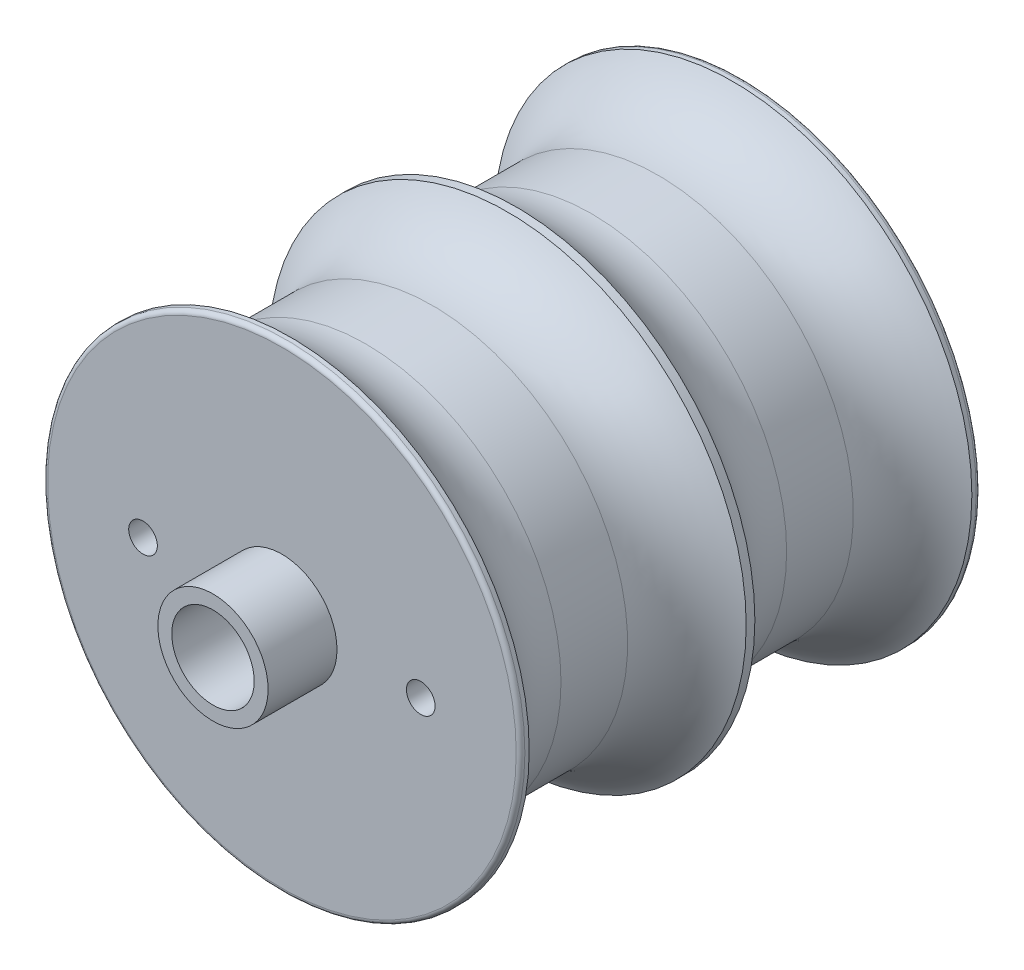
ISO-10303-21;
HEADER;
FILE_DESCRIPTION(('STEP AP214'),'2;1');
FILE_NAME('part.step','',(''),(''),'','','');
FILE_SCHEMA(('AUTOMOTIVE_DESIGN { 1 0 10303 214 1 1 1 1 }'));
ENDSEC;
DATA;
#1=APPLICATION_CONTEXT('core data for automotive mechanical design processes');
#2=APPLICATION_PROTOCOL_DEFINITION('international standard','automotive_design',2000,#1);
#3=PRODUCT_CONTEXT('',#1,'mechanical');
#4=PRODUCT('Part','Part','',(#3));
#5=PRODUCT_RELATED_PRODUCT_CATEGORY('part','',(#4));
#6=PRODUCT_DEFINITION_FORMATION('','',#4);
#7=PRODUCT_DEFINITION_CONTEXT('part definition',#1,'design');
#8=PRODUCT_DEFINITION('design','',#6,#7);
#9=PRODUCT_DEFINITION_SHAPE('','',#8);
#10=(LENGTH_UNIT() NAMED_UNIT(*) SI_UNIT(.MILLI.,.METRE.));
#11=(NAMED_UNIT(*) PLANE_ANGLE_UNIT() SI_UNIT($,.RADIAN.));
#12=(NAMED_UNIT(*) SI_UNIT($,.STERADIAN.) SOLID_ANGLE_UNIT());
#13=UNCERTAINTY_MEASURE_WITH_UNIT(LENGTH_MEASURE(1.E-05),#10,'distance_accuracy_value','');
#14=(GEOMETRIC_REPRESENTATION_CONTEXT(3) GLOBAL_UNCERTAINTY_ASSIGNED_CONTEXT((#13)) GLOBAL_UNIT_ASSIGNED_CONTEXT((#10,
#11,#12)) REPRESENTATION_CONTEXT('',''));
#15=CARTESIAN_POINT('',(0.,0.,0.));
#16=DIRECTION('',(0.,0.,1.));
#17=DIRECTION('',(1.,0.,0.));
#18=AXIS2_PLACEMENT_3D('',#15,#16,#17);
#19=CARTESIAN_POINT('',(0.,0.,60.938));
#20=DIRECTION('',(0.,0.,1.));
#21=DIRECTION('',(1.,0.,0.));
#22=AXIS2_PLACEMENT_3D('',#19,#20,#21);
#23=PLANE('',#22);
#24=CARTESIAN_POINT('',(0.,0.,60.938));
#25=DIRECTION('',(0.,0.,1.));
#26=DIRECTION('',(1.,0.,0.));
#27=AXIS2_PLACEMENT_3D('',#24,#25,#26);
#28=CIRCLE('',#27,6.35);
#29=CARTESIAN_POINT('',(6.35,0.,60.938));
#30=VERTEX_POINT('',#29);
#31=EDGE_CURVE('E12',#30,#30,#28,.T.);
#32=ORIENTED_EDGE('',*,*,#31,.T.);
#33=EDGE_LOOP('',(#32));
#34=FACE_BOUND('',#33,.T.);
#35=CARTESIAN_POINT('',(0.,0.,60.938));
#36=DIRECTION('',(0.,0.,1.));
#37=DIRECTION('',(1.,0.,0.));
#38=AXIS2_PLACEMENT_3D('',#35,#36,#37);
#39=CIRCLE('',#38,4.75);
#40=CARTESIAN_POINT('',(4.75,0.,60.938));
#41=VERTEX_POINT('',#40);
#42=EDGE_CURVE('E134',#41,#41,#39,.T.);
#43=ORIENTED_EDGE('',*,*,#42,.F.);
#44=EDGE_LOOP('',(#43));
#45=FACE_BOUND('',#44,.T.);
#46=ADVANCED_FACE('F123',(#34,#45),#23,.T.);
#47=CARTESIAN_POINT('',(0.,0.,53.));
#48=DIRECTION('',(0.,0.,1.));
#49=DIRECTION('',(1.,0.,0.));
#50=AXIS2_PLACEMENT_3D('',#47,#48,#49);
#51=PLANE('',#50);
#52=CARTESIAN_POINT('',(0.,0.,53.));
#53=DIRECTION('',(0.,0.,1.));
#54=DIRECTION('',(1.,0.,0.));
#55=AXIS2_PLACEMENT_3D('',#52,#53,#54);
#56=CIRCLE('',#55,6.35);
#57=CARTESIAN_POINT('',(6.35,0.,53.));
#58=VERTEX_POINT('',#57);
#59=EDGE_CURVE('E127',#58,#58,#56,.T.);
#60=ORIENTED_EDGE('',*,*,#59,.F.);
#61=EDGE_LOOP('',(#60));
#62=FACE_BOUND('',#61,.T.);
#63=CARTESIAN_POINT('',(0.,0.,53.));
#64=DIRECTION('',(0.,0.,1.));
#65=DIRECTION('',(1.,0.,0.));
#66=AXIS2_PLACEMENT_3D('',#63,#64,#65);
#67=CIRCLE('',#66,4.75);
#68=CARTESIAN_POINT('',(4.75,0.,53.));
#69=VERTEX_POINT('',#68);
#70=EDGE_CURVE('E136',#69,#69,#67,.T.);
#71=ORIENTED_EDGE('',*,*,#70,.T.);
#72=EDGE_LOOP('',(#71));
#73=FACE_BOUND('',#72,.T.);
#74=ADVANCED_FACE('F146',(#62,#73),#51,.F.);
#75=CARTESIAN_POINT('',(0.,0.,60.938));
#76=DIRECTION('',(0.,0.,-1.));
#77=DIRECTION('',(-1.,0.,0.));
#78=AXIS2_PLACEMENT_3D('',#75,#76,#77);
#79=CYLINDRICAL_SURFACE('',#78,6.35);
#80=ORIENTED_EDGE('',*,*,#31,.F.);
#81=EDGE_LOOP('',(#80));
#82=FACE_BOUND('',#81,.T.);
#83=ORIENTED_EDGE('',*,*,#59,.T.);
#84=EDGE_LOOP('',(#83));
#85=FACE_BOUND('',#84,.T.);
#86=ADVANCED_FACE('F125',(#82,#85),#79,.T.);
#87=CARTESIAN_POINT('',(0.,0.,60.938));
#88=DIRECTION('',(0.,0.,-1.));
#89=DIRECTION('',(-1.,0.,0.));
#90=AXIS2_PLACEMENT_3D('',#87,#88,#89);
#91=CYLINDRICAL_SURFACE('',#90,4.75);
#92=ORIENTED_EDGE('',*,*,#42,.T.);
#93=EDGE_LOOP('',(#92));
#94=FACE_BOUND('',#93,.T.);
#95=ORIENTED_EDGE('',*,*,#70,.F.);
#96=EDGE_LOOP('',(#95));
#97=FACE_BOUND('',#96,.T.);
#98=ADVANCED_FACE('F142',(#94,#97),#91,.F.);
#99=CLOSED_SHELL('',(#46,#74,#86,#98));
#100=MANIFOLD_SOLID_BREP('B2',#99);
#101=CARTESIAN_POINT('',(0.,0.,1.));
#102=DIRECTION('',(0.,0.,-1.));
#103=DIRECTION('',(-1.,0.,0.));
#104=AXIS2_PLACEMENT_3D('',#101,#102,#103);
#105=CYLINDRICAL_SURFACE('',#104,27.5);
#106=CARTESIAN_POINT('',(0.,0.,0.5));
#107=DIRECTION('',(0.,0.,1.));
#108=DIRECTION('',(1.,0.,0.));
#109=AXIS2_PLACEMENT_3D('',#106,#107,#108);
#110=CIRCLE('',#109,27.5);
#111=CARTESIAN_POINT('',(27.5,0.,0.5));
#112=VERTEX_POINT('',#111);
#113=EDGE_CURVE('E200',#112,#112,#110,.T.);
#114=ORIENTED_EDGE('',*,*,#113,.T.);
#115=EDGE_LOOP('',(#114));
#116=FACE_BOUND('',#115,.T.);
#117=CARTESIAN_POINT('',(0.,0.,1.));
#118=DIRECTION('',(0.,0.,1.));
#119=DIRECTION('',(1.,0.,0.));
#120=AXIS2_PLACEMENT_3D('',#117,#118,#119);
#121=CIRCLE('',#120,27.5);
#122=CARTESIAN_POINT('',(27.5,0.,1.));
#123=VERTEX_POINT('',#122);
#124=EDGE_CURVE('E225',#123,#123,#121,.T.);
#125=ORIENTED_EDGE('',*,*,#124,.F.);
#126=EDGE_LOOP('',(#125));
#127=FACE_BOUND('',#126,.T.);
#128=ADVANCED_FACE('F193',(#116,#127),#105,.T.);
#129=CARTESIAN_POINT('',(-16.,0.,1.));
#130=DIRECTION('',(0.,0.,-1.));
#131=DIRECTION('',(-1.,0.,0.));
#132=AXIS2_PLACEMENT_3D('',#129,#130,#131);
#133=CYLINDRICAL_SURFACE('',#132,1.65);
#134=CARTESIAN_POINT('',(-16.,0.,0.));
#135=DIRECTION('',(0.,0.,1.));
#136=DIRECTION('',(1.,0.,0.));
#137=AXIS2_PLACEMENT_3D('',#134,#135,#136);
#138=CIRCLE('',#137,1.65);
#139=CARTESIAN_POINT('',(-14.35,0.,0.));
#140=VERTEX_POINT('',#139);
#141=EDGE_CURVE('E229',#140,#140,#138,.T.);
#142=ORIENTED_EDGE('',*,*,#141,.F.);
#143=EDGE_LOOP('',(#142));
#144=FACE_BOUND('',#143,.T.);
#145=CARTESIAN_POINT('',(-16.,0.,53.));
#146=DIRECTION('',(0.,0.,1.));
#147=DIRECTION('',(1.,0.,0.));
#148=AXIS2_PLACEMENT_3D('',#145,#146,#147);
#149=CIRCLE('',#148,1.65);
#150=CARTESIAN_POINT('',(-14.35,0.,53.));
#151=VERTEX_POINT('',#150);
#152=EDGE_CURVE('E249',#151,#151,#149,.T.);
#153=ORIENTED_EDGE('',*,*,#152,.T.);
#154=EDGE_LOOP('',(#153));
#155=FACE_BOUND('',#154,.T.);
#156=ADVANCED_FACE('F276',(#144,#155),#133,.F.);
#157=CARTESIAN_POINT('',(16.,0.,1.));
#158=DIRECTION('',(0.,0.,-1.));
#159=DIRECTION('',(-1.,0.,0.));
#160=AXIS2_PLACEMENT_3D('',#157,#158,#159);
#161=CYLINDRICAL_SURFACE('',#160,1.65);
#162=CARTESIAN_POINT('',(16.,0.,0.));
#163=DIRECTION('',(0.,0.,1.));
#164=DIRECTION('',(1.,0.,0.));
#165=AXIS2_PLACEMENT_3D('',#162,#163,#164);
#166=CIRCLE('',#165,1.65);
#167=CARTESIAN_POINT('',(17.65,0.,0.));
#168=VERTEX_POINT('',#167);
#169=EDGE_CURVE('E232',#168,#168,#166,.T.);
#170=ORIENTED_EDGE('',*,*,#169,.F.);
#171=EDGE_LOOP('',(#170));
#172=FACE_BOUND('',#171,.T.);
#173=CARTESIAN_POINT('',(16.,0.,53.));
#174=DIRECTION('',(0.,0.,1.));
#175=DIRECTION('',(1.,0.,0.));
#176=AXIS2_PLACEMENT_3D('',#173,#174,#175);
#177=CIRCLE('',#176,1.65);
#178=CARTESIAN_POINT('',(17.65,0.,53.));
#179=VERTEX_POINT('',#178);
#180=EDGE_CURVE('E252',#179,#179,#177,.T.);
#181=ORIENTED_EDGE('',*,*,#180,.T.);
#182=EDGE_LOOP('',(#181));
#183=FACE_BOUND('',#182,.T.);
#184=ADVANCED_FACE('F256',(#172,#183),#161,.F.);
#185=CARTESIAN_POINT('',(0.,0.,1.));
#186=DIRECTION('',(0.,0.,-1.));
#187=DIRECTION('',(-1.,0.,0.));
#188=AXIS2_PLACEMENT_3D('',#185,#186,#187);
#189=CYLINDRICAL_SURFACE('',#188,4.75);
#190=CARTESIAN_POINT('',(0.,0.,0.));
#191=DIRECTION('',(0.,0.,1.));
#192=DIRECTION('',(1.,0.,0.));
#193=AXIS2_PLACEMENT_3D('',#190,#191,#192);
#194=CIRCLE('',#193,4.75);
#195=CARTESIAN_POINT('',(4.75,0.,0.));
#196=VERTEX_POINT('',#195);
#197=EDGE_CURVE('E226',#196,#196,#194,.T.);
#198=ORIENTED_EDGE('',*,*,#197,.F.);
#199=EDGE_LOOP('',(#198));
#200=FACE_BOUND('',#199,.T.);
#201=CARTESIAN_POINT('',(0.,0.,53.));
#202=DIRECTION('',(0.,0.,1.));
#203=DIRECTION('',(1.,0.,0.));
#204=AXIS2_PLACEMENT_3D('',#201,#202,#203);
#205=CIRCLE('',#204,4.75);
#206=CARTESIAN_POINT('',(4.75,0.,53.));
#207=VERTEX_POINT('',#206);
#208=EDGE_CURVE('E246',#207,#207,#205,.T.);
#209=ORIENTED_EDGE('',*,*,#208,.T.);
#210=EDGE_LOOP('',(#209));
#211=FACE_BOUND('',#210,.T.);
#212=ADVANCED_FACE('F285',(#200,#211),#189,.F.);
#213=CARTESIAN_POINT('',(0.,0.,0.));
#214=DIRECTION('',(0.,0.,1.));
#215=DIRECTION('',(1.,0.,0.));
#216=AXIS2_PLACEMENT_3D('',#213,#214,#215);
#217=PLANE('',#216);
#218=CARTESIAN_POINT('',(0.,0.,0.));
#219=DIRECTION('',(0.,0.,1.));
#220=DIRECTION('',(1.,0.,0.));
#221=AXIS2_PLACEMENT_3D('',#218,#219,#220);
#222=CIRCLE('',#221,27.);
#223=CARTESIAN_POINT('',(27.,0.,0.));
#224=VERTEX_POINT('',#223);
#225=EDGE_CURVE('E122',#224,#224,#222,.F.);
#226=ORIENTED_EDGE('',*,*,#225,.T.);
#227=EDGE_LOOP('',(#226));
#228=FACE_BOUND('',#227,.T.);
#229=ORIENTED_EDGE('',*,*,#169,.T.);
#230=EDGE_LOOP('',(#229));
#231=FACE_BOUND('',#230,.T.);
#232=ORIENTED_EDGE('',*,*,#141,.T.);
#233=EDGE_LOOP('',(#232));
#234=FACE_BOUND('',#233,.T.);
#235=ORIENTED_EDGE('',*,*,#197,.T.);
#236=EDGE_LOOP('',(#235));
#237=FACE_BOUND('',#236,.T.);
#238=ADVANCED_FACE('F346',(#228,#231,#234,#237),#217,.F.);
#239=CARTESIAN_POINT('',(0.,0.,26.));
#240=DIRECTION('',(0.,0.,-1.));
#241=DIRECTION('',(-1.,0.,0.));
#242=AXIS2_PLACEMENT_3D('',#239,#240,#241);
#243=CYLINDRICAL_SURFACE('',#242,22.5);
#244=CARTESIAN_POINT('',(0.,0.,17.3397459621556));
#245=DIRECTION('',(0.,0.,1.));
#246=DIRECTION('',(1.,0.,0.));
#247=AXIS2_PLACEMENT_3D('',#244,#245,#246);
#248=CIRCLE('',#247,22.5);
#249=CARTESIAN_POINT('',(22.5,0.,17.3397459621556));
#250=VERTEX_POINT('',#249);
#251=EDGE_CURVE('E213',#250,#250,#248,.F.);
#252=ORIENTED_EDGE('',*,*,#251,.T.);
#253=EDGE_LOOP('',(#252));
#254=FACE_BOUND('',#253,.T.);
#255=CARTESIAN_POINT('',(0.,0.,9.66025403784438));
#256=DIRECTION('',(0.,0.,-1.));
#257=DIRECTION('',(-1.,0.,0.));
#258=AXIS2_PLACEMENT_3D('',#255,#256,#257);
#259=CIRCLE('',#258,22.5);
#260=CARTESIAN_POINT('',(-22.5,0.,9.66025403784438));
#261=VERTEX_POINT('',#260);
#262=EDGE_CURVE('E216',#261,#261,#259,.F.);
#263=ORIENTED_EDGE('',*,*,#262,.T.);
#264=EDGE_LOOP('',(#263));
#265=FACE_BOUND('',#264,.T.);
#266=ADVANCED_FACE('F350',(#254,#265),#243,.T.);
#267=CARTESIAN_POINT('',(0.,0.,27.));
#268=DIRECTION('',(0.,0.,-1.));
#269=DIRECTION('',(-1.,0.,0.));
#270=AXIS2_PLACEMENT_3D('',#267,#268,#269);
#271=CYLINDRICAL_SURFACE('',#270,27.5);
#272=CARTESIAN_POINT('',(0.,0.,27.));
#273=DIRECTION('',(0.,0.,1.));
#274=DIRECTION('',(1.,0.,0.));
#275=AXIS2_PLACEMENT_3D('',#272,#273,#274);
#276=CIRCLE('',#275,27.5);
#277=CARTESIAN_POINT('',(27.5,0.,27.));
#278=VERTEX_POINT('',#277);
#279=EDGE_CURVE('E235',#278,#278,#276,.T.);
#280=ORIENTED_EDGE('',*,*,#279,.F.);
#281=EDGE_LOOP('',(#280));
#282=FACE_BOUND('',#281,.T.);
#283=CARTESIAN_POINT('',(0.,0.,26.));
#284=DIRECTION('',(0.,0.,1.));
#285=DIRECTION('',(1.,0.,0.));
#286=AXIS2_PLACEMENT_3D('',#283,#284,#285);
#287=CIRCLE('',#286,27.5);
#288=CARTESIAN_POINT('',(27.5,0.,26.));
#289=VERTEX_POINT('',#288);
#290=EDGE_CURVE('E238',#289,#289,#287,.T.);
#291=ORIENTED_EDGE('',*,*,#290,.T.);
#292=EDGE_LOOP('',(#291));
#293=FACE_BOUND('',#292,.T.);
#294=ADVANCED_FACE('F271',(#282,#293),#271,.T.);
#295=CARTESIAN_POINT('',(0.,0.,52.));
#296=DIRECTION('',(0.,0.,-1.));
#297=DIRECTION('',(-1.,0.,0.));
#298=AXIS2_PLACEMENT_3D('',#295,#296,#297);
#299=CYLINDRICAL_SURFACE('',#298,22.5);
#300=CARTESIAN_POINT('',(0.,0.,43.3397459621556));
#301=DIRECTION('',(0.,0.,1.));
#302=DIRECTION('',(1.,0.,0.));
#303=AXIS2_PLACEMENT_3D('',#300,#301,#302);
#304=CIRCLE('',#303,22.5);
#305=CARTESIAN_POINT('',(22.5,0.,43.3397459621556));
#306=VERTEX_POINT('',#305);
#307=EDGE_CURVE('E219',#306,#306,#304,.F.);
#308=ORIENTED_EDGE('',*,*,#307,.T.);
#309=EDGE_LOOP('',(#308));
#310=FACE_BOUND('',#309,.T.);
#311=CARTESIAN_POINT('',(0.,0.,35.6602540378444));
#312=DIRECTION('',(0.,0.,-1.));
#313=DIRECTION('',(-1.,0.,0.));
#314=AXIS2_PLACEMENT_3D('',#311,#312,#313);
#315=CIRCLE('',#314,22.5);
#316=CARTESIAN_POINT('',(-22.5,0.,35.6602540378444));
#317=VERTEX_POINT('',#316);
#318=EDGE_CURVE('E222',#317,#317,#315,.F.);
#319=ORIENTED_EDGE('',*,*,#318,.T.);
#320=EDGE_LOOP('',(#319));
#321=FACE_BOUND('',#320,.T.);
#322=ADVANCED_FACE('F261',(#310,#321),#299,.T.);
#323=CARTESIAN_POINT('',(0.,0.,53.));
#324=DIRECTION('',(0.,0.,1.));
#325=DIRECTION('',(1.,0.,0.));
#326=AXIS2_PLACEMENT_3D('',#323,#324,#325);
#327=PLANE('',#326);
#328=CARTESIAN_POINT('',(0.,0.,53.));
#329=DIRECTION('',(0.,0.,1.));
#330=DIRECTION('',(1.,0.,0.));
#331=AXIS2_PLACEMENT_3D('',#328,#329,#330);
#332=CIRCLE('',#331,27.);
#333=CARTESIAN_POINT('',(27.,0.,53.));
#334=VERTEX_POINT('',#333);
#335=EDGE_CURVE('E208',#334,#334,#332,.T.);
#336=ORIENTED_EDGE('',*,*,#335,.T.);
#337=EDGE_LOOP('',(#336));
#338=FACE_BOUND('',#337,.T.);
#339=ORIENTED_EDGE('',*,*,#152,.F.);
#340=EDGE_LOOP('',(#339));
#341=FACE_BOUND('',#340,.T.);
#342=ORIENTED_EDGE('',*,*,#208,.F.);
#343=EDGE_LOOP('',(#342));
#344=FACE_BOUND('',#343,.T.);
#345=ORIENTED_EDGE('',*,*,#180,.F.);
#346=EDGE_LOOP('',(#345));
#347=FACE_BOUND('',#346,.T.);
#348=ADVANCED_FACE('F258',(#338,#341,#344,#347),#327,.T.);
#349=CARTESIAN_POINT('',(0.,0.,53.));
#350=DIRECTION('',(0.,0.,-1.));
#351=DIRECTION('',(-1.,0.,0.));
#352=AXIS2_PLACEMENT_3D('',#349,#350,#351);
#353=CYLINDRICAL_SURFACE('',#352,27.5);
#354=CARTESIAN_POINT('',(0.,0.,52.5));
#355=DIRECTION('',(0.,0.,1.));
#356=DIRECTION('',(1.,0.,0.));
#357=AXIS2_PLACEMENT_3D('',#354,#355,#356);
#358=CIRCLE('',#357,27.5);
#359=CARTESIAN_POINT('',(27.5,0.,52.5));
#360=VERTEX_POINT('',#359);
#361=EDGE_CURVE('E204',#360,#360,#358,.F.);
#362=ORIENTED_EDGE('',*,*,#361,.T.);
#363=EDGE_LOOP('',(#362));
#364=FACE_BOUND('',#363,.T.);
#365=CARTESIAN_POINT('',(0.,0.,52.));
#366=DIRECTION('',(0.,0.,1.));
#367=DIRECTION('',(1.,0.,0.));
#368=AXIS2_PLACEMENT_3D('',#365,#366,#367);
#369=CIRCLE('',#368,27.5);
#370=CARTESIAN_POINT('',(27.5,0.,52.));
#371=VERTEX_POINT('',#370);
#372=EDGE_CURVE('E241',#371,#371,#369,.T.);
#373=ORIENTED_EDGE('',*,*,#372,.T.);
#374=EDGE_LOOP('',(#373));
#375=FACE_BOUND('',#374,.T.);
#376=ADVANCED_FACE('F260',(#364,#375),#353,.T.);
#377=CARTESIAN_POINT('',(0.,0.,43.3397459621556));
#378=DIRECTION('',(0.,0.,1.));
#379=DIRECTION('',(1.,0.,0.));
#380=AXIS2_PLACEMENT_3D('',#377,#378,#379);
#381=TOROIDAL_SURFACE('',#380,32.5,10.);
#382=ORIENTED_EDGE('',*,*,#307,.F.);
#383=EDGE_LOOP('',(#382));
#384=FACE_BOUND('',#383,.T.);
#385=ORIENTED_EDGE('',*,*,#372,.F.);
#386=EDGE_LOOP('',(#385));
#387=FACE_BOUND('',#386,.T.);
#388=ADVANCED_FACE('F268',(#384,#387),#381,.F.);
#389=CARTESIAN_POINT('',(0.,0.,35.6602540378444));
#390=DIRECTION('',(0.,0.,-1.));
#391=DIRECTION('',(-1.,0.,0.));
#392=AXIS2_PLACEMENT_3D('',#389,#390,#391);
#393=TOROIDAL_SURFACE('',#392,32.5,10.);
#394=ORIENTED_EDGE('',*,*,#279,.T.);
#395=EDGE_LOOP('',(#394));
#396=FACE_BOUND('',#395,.T.);
#397=ORIENTED_EDGE('',*,*,#318,.F.);
#398=EDGE_LOOP('',(#397));
#399=FACE_BOUND('',#398,.T.);
#400=ADVANCED_FACE('F293',(#396,#399),#393,.F.);
#401=CARTESIAN_POINT('',(0.,0.,17.3397459621556));
#402=DIRECTION('',(0.,0.,1.));
#403=DIRECTION('',(1.,0.,0.));
#404=AXIS2_PLACEMENT_3D('',#401,#402,#403);
#405=TOROIDAL_SURFACE('',#404,32.5,10.);
#406=ORIENTED_EDGE('',*,*,#251,.F.);
#407=EDGE_LOOP('',(#406));
#408=FACE_BOUND('',#407,.T.);
#409=ORIENTED_EDGE('',*,*,#290,.F.);
#410=EDGE_LOOP('',(#409));
#411=FACE_BOUND('',#410,.T.);
#412=ADVANCED_FACE('F297',(#408,#411),#405,.F.);
#413=CARTESIAN_POINT('',(0.,0.,9.66025403784438));
#414=DIRECTION('',(0.,0.,-1.));
#415=DIRECTION('',(-1.,0.,0.));
#416=AXIS2_PLACEMENT_3D('',#413,#414,#415);
#417=TOROIDAL_SURFACE('',#416,32.5,10.);
#418=ORIENTED_EDGE('',*,*,#124,.T.);
#419=EDGE_LOOP('',(#418));
#420=FACE_BOUND('',#419,.T.);
#421=ORIENTED_EDGE('',*,*,#262,.F.);
#422=EDGE_LOOP('',(#421));
#423=FACE_BOUND('',#422,.T.);
#424=ADVANCED_FACE('F301',(#420,#423),#417,.F.);
#425=CARTESIAN_POINT('',(0.,0.,52.5));
#426=DIRECTION('',(0.,0.,1.));
#427=DIRECTION('',(1.,0.,0.));
#428=AXIS2_PLACEMENT_3D('',#425,#426,#427);
#429=TOROIDAL_SURFACE('',#428,27.,0.5);
#430=ORIENTED_EDGE('',*,*,#361,.F.);
#431=EDGE_LOOP('',(#430));
#432=FACE_BOUND('',#431,.T.);
#433=ORIENTED_EDGE('',*,*,#335,.F.);
#434=EDGE_LOOP('',(#433));
#435=FACE_BOUND('',#434,.T.);
#436=ADVANCED_FACE('F304',(#432,#435),#429,.T.);
#437=CARTESIAN_POINT('',(0.,0.,0.5));
#438=DIRECTION('',(0.,0.,1.));
#439=DIRECTION('',(1.,0.,0.));
#440=AXIS2_PLACEMENT_3D('',#437,#438,#439);
#441=TOROIDAL_SURFACE('',#440,27.,0.5);
#442=ORIENTED_EDGE('',*,*,#225,.F.);
#443=EDGE_LOOP('',(#442));
#444=FACE_BOUND('',#443,.T.);
#445=ORIENTED_EDGE('',*,*,#113,.F.);
#446=EDGE_LOOP('',(#445));
#447=FACE_BOUND('',#446,.T.);
#448=ADVANCED_FACE('F195',(#444,#447),#441,.T.);
#449=CLOSED_SHELL('',(#128,#156,#184,#212,#238,#266,#294,#322,#348,#376,#388,#400,#412,#424,
#436,#448));
#450=MANIFOLD_SOLID_BREP('B7',#449);
#451=ADVANCED_BREP_SHAPE_REPRESENTATION('',(#18,#100,#450),#14);
#452=SHAPE_DEFINITION_REPRESENTATION(#9,#451);
ENDSEC;
END-ISO-10303-21;
